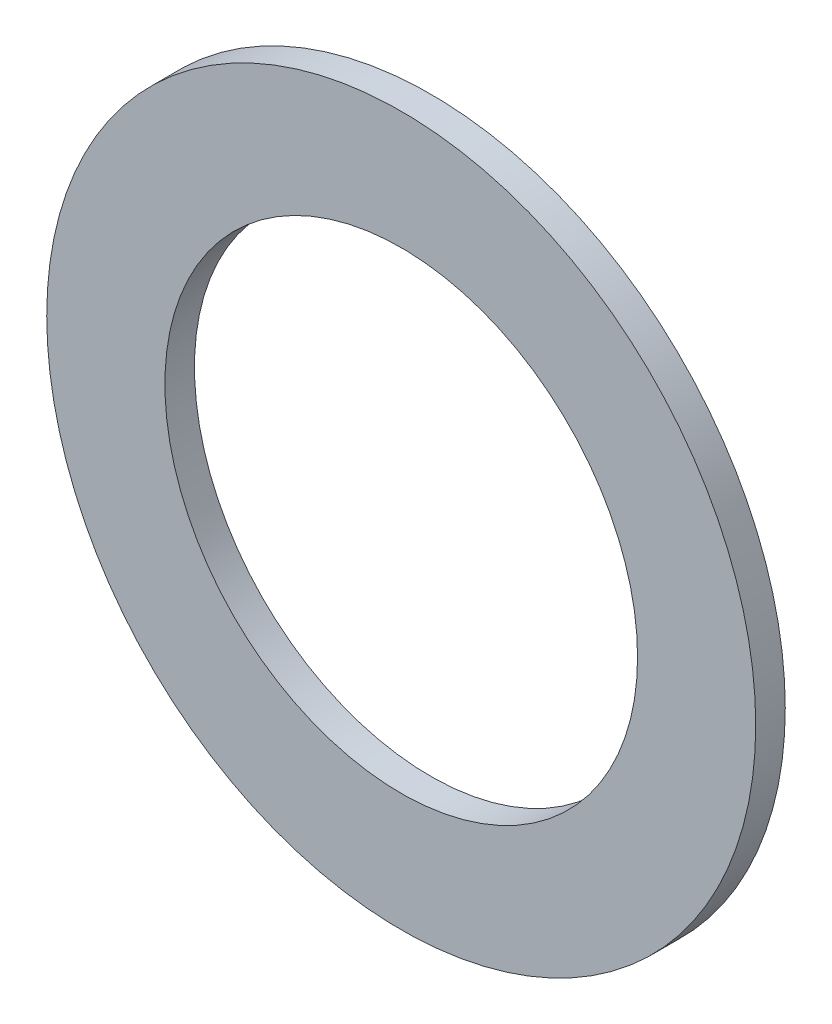
ISO-10303-21;
HEADER;
FILE_DESCRIPTION(('STEP AP214'),'2;1');
FILE_NAME('part.step','',(''),(''),'','','');
FILE_SCHEMA(('AUTOMOTIVE_DESIGN { 1 0 10303 214 1 1 1 1 }'));
ENDSEC;
DATA;
#1=APPLICATION_CONTEXT('core data for automotive mechanical design processes');
#2=APPLICATION_PROTOCOL_DEFINITION('international standard','automotive_design',2000,#1);
#3=PRODUCT_CONTEXT('',#1,'mechanical');
#4=PRODUCT('Part','Part','',(#3));
#5=PRODUCT_RELATED_PRODUCT_CATEGORY('part','',(#4));
#6=PRODUCT_DEFINITION_FORMATION('','',#4);
#7=PRODUCT_DEFINITION_CONTEXT('part definition',#1,'design');
#8=PRODUCT_DEFINITION('design','',#6,#7);
#9=PRODUCT_DEFINITION_SHAPE('','',#8);
#10=(LENGTH_UNIT() NAMED_UNIT(*) SI_UNIT(.MILLI.,.METRE.));
#11=(NAMED_UNIT(*) PLANE_ANGLE_UNIT() SI_UNIT($,.RADIAN.));
#12=(NAMED_UNIT(*) SI_UNIT($,.STERADIAN.) SOLID_ANGLE_UNIT());
#13=UNCERTAINTY_MEASURE_WITH_UNIT(LENGTH_MEASURE(1.E-05),#10,'distance_accuracy_value','');
#14=(GEOMETRIC_REPRESENTATION_CONTEXT(3) GLOBAL_UNCERTAINTY_ASSIGNED_CONTEXT((#13)) GLOBAL_UNIT_ASSIGNED_CONTEXT((#10,
#11,#12)) REPRESENTATION_CONTEXT('',''));
#15=CARTESIAN_POINT('',(0.,0.,0.));
#16=DIRECTION('',(0.,0.,1.));
#17=DIRECTION('',(1.,0.,0.));
#18=AXIS2_PLACEMENT_3D('',#15,#16,#17);
#19=CARTESIAN_POINT('',(0.,0.,6.35));
#20=DIRECTION('',(0.,0.,1.));
#21=DIRECTION('',(1.,0.,0.));
#22=AXIS2_PLACEMENT_3D('',#19,#20,#21);
#23=PLANE('',#22);
#24=CARTESIAN_POINT('',(0.,0.,6.35));
#25=DIRECTION('',(0.,0.,1.));
#26=DIRECTION('',(1.,0.,0.));
#27=AXIS2_PLACEMENT_3D('',#24,#25,#26);
#28=CIRCLE('',#27,76.2);
#29=CARTESIAN_POINT('',(76.2,0.,6.35));
#30=VERTEX_POINT('',#29);
#31=EDGE_CURVE('E10',#30,#30,#28,.T.);
#32=ORIENTED_EDGE('',*,*,#31,.T.);
#33=EDGE_LOOP('',(#32));
#34=FACE_BOUND('',#33,.T.);
#35=CARTESIAN_POINT('',(0.,0.,6.35));
#36=DIRECTION('',(0.,0.,1.));
#37=DIRECTION('',(1.,0.,0.));
#38=AXIS2_PLACEMENT_3D('',#35,#36,#37);
#39=CIRCLE('',#38,50.8);
#40=CARTESIAN_POINT('',(50.8,0.,6.35));
#41=VERTEX_POINT('',#40);
#42=EDGE_CURVE('E42',#41,#41,#39,.T.);
#43=ORIENTED_EDGE('',*,*,#42,.F.);
#44=EDGE_LOOP('',(#43));
#45=FACE_BOUND('',#44,.T.);
#46=ADVANCED_FACE('F31',(#34,#45),#23,.T.);
#47=CARTESIAN_POINT('',(0.,0.,0.));
#48=DIRECTION('',(0.,0.,1.));
#49=DIRECTION('',(1.,0.,0.));
#50=AXIS2_PLACEMENT_3D('',#47,#48,#49);
#51=PLANE('',#50);
#52=CARTESIAN_POINT('',(0.,0.,0.));
#53=DIRECTION('',(0.,0.,1.));
#54=DIRECTION('',(1.,0.,0.));
#55=AXIS2_PLACEMENT_3D('',#52,#53,#54);
#56=CIRCLE('',#55,76.2);
#57=CARTESIAN_POINT('',(76.2,0.,0.));
#58=VERTEX_POINT('',#57);
#59=EDGE_CURVE('E35',#58,#58,#56,.T.);
#60=ORIENTED_EDGE('',*,*,#59,.F.);
#61=EDGE_LOOP('',(#60));
#62=FACE_BOUND('',#61,.T.);
#63=CARTESIAN_POINT('',(0.,0.,0.));
#64=DIRECTION('',(0.,0.,1.));
#65=DIRECTION('',(1.,0.,0.));
#66=AXIS2_PLACEMENT_3D('',#63,#64,#65);
#67=CIRCLE('',#66,50.8);
#68=CARTESIAN_POINT('',(50.8,0.,0.));
#69=VERTEX_POINT('',#68);
#70=EDGE_CURVE('E44',#69,#69,#67,.T.);
#71=ORIENTED_EDGE('',*,*,#70,.T.);
#72=EDGE_LOOP('',(#71));
#73=FACE_BOUND('',#72,.T.);
#74=ADVANCED_FACE('F54',(#62,#73),#51,.F.);
#75=CARTESIAN_POINT('',(0.,0.,6.35));
#76=DIRECTION('',(0.,0.,-1.));
#77=DIRECTION('',(-1.,0.,0.));
#78=AXIS2_PLACEMENT_3D('',#75,#76,#77);
#79=CYLINDRICAL_SURFACE('',#78,76.2);
#80=ORIENTED_EDGE('',*,*,#31,.F.);
#81=EDGE_LOOP('',(#80));
#82=FACE_BOUND('',#81,.T.);
#83=ORIENTED_EDGE('',*,*,#59,.T.);
#84=EDGE_LOOP('',(#83));
#85=FACE_BOUND('',#84,.T.);
#86=ADVANCED_FACE('F33',(#82,#85),#79,.T.);
#87=CARTESIAN_POINT('',(0.,0.,6.35));
#88=DIRECTION('',(0.,0.,-1.));
#89=DIRECTION('',(-1.,0.,0.));
#90=AXIS2_PLACEMENT_3D('',#87,#88,#89);
#91=CYLINDRICAL_SURFACE('',#90,50.8);
#92=ORIENTED_EDGE('',*,*,#42,.T.);
#93=EDGE_LOOP('',(#92));
#94=FACE_BOUND('',#93,.T.);
#95=ORIENTED_EDGE('',*,*,#70,.F.);
#96=EDGE_LOOP('',(#95));
#97=FACE_BOUND('',#96,.T.);
#98=ADVANCED_FACE('F50',(#94,#97),#91,.F.);
#99=CLOSED_SHELL('',(#46,#74,#86,#98));
#100=MANIFOLD_SOLID_BREP('B2',#99);
#101=ADVANCED_BREP_SHAPE_REPRESENTATION('',(#18,#100),#14);
#102=SHAPE_DEFINITION_REPRESENTATION(#9,#101);
ENDSEC;
END-ISO-10303-21;
